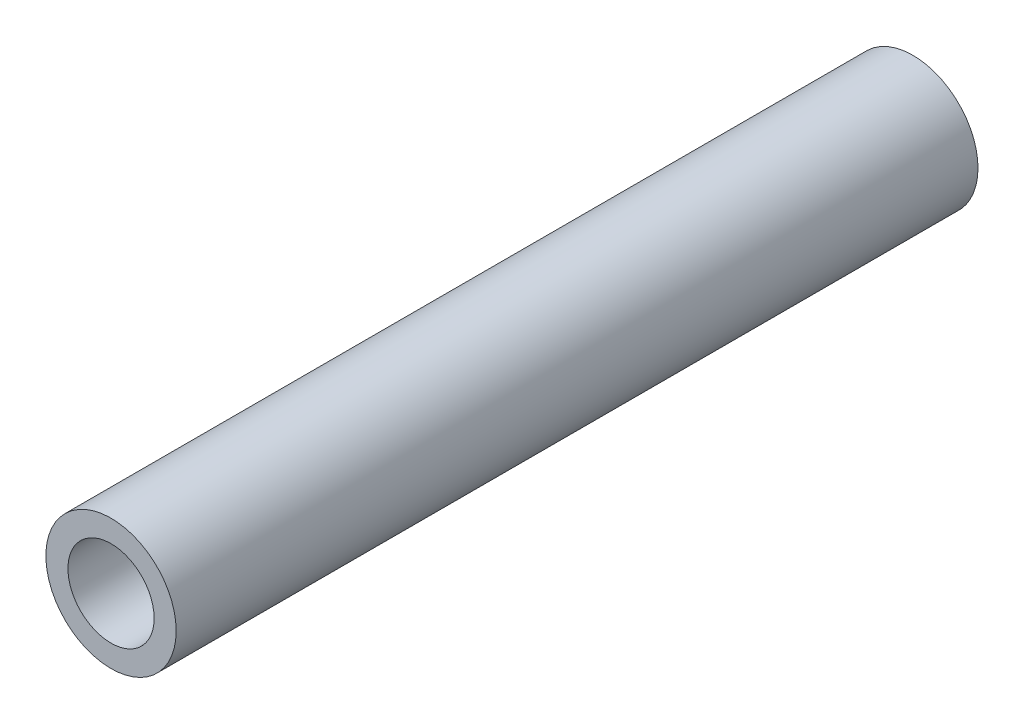
ISO-10303-21;
HEADER;
FILE_DESCRIPTION(('STEP AP214'),'2;1');
FILE_NAME('part.step','',(''),(''),'','','');
FILE_SCHEMA(('AUTOMOTIVE_DESIGN { 1 0 10303 214 1 1 1 1 }'));
ENDSEC;
DATA;
#1=APPLICATION_CONTEXT('core data for automotive mechanical design processes');
#2=APPLICATION_PROTOCOL_DEFINITION('international standard','automotive_design',2000,#1);
#3=PRODUCT_CONTEXT('',#1,'mechanical');
#4=PRODUCT('Part','Part','',(#3));
#5=PRODUCT_RELATED_PRODUCT_CATEGORY('part','',(#4));
#6=PRODUCT_DEFINITION_FORMATION('','',#4);
#7=PRODUCT_DEFINITION_CONTEXT('part definition',#1,'design');
#8=PRODUCT_DEFINITION('design','',#6,#7);
#9=PRODUCT_DEFINITION_SHAPE('','',#8);
#10=(LENGTH_UNIT() NAMED_UNIT(*) SI_UNIT(.MILLI.,.METRE.));
#11=(NAMED_UNIT(*) PLANE_ANGLE_UNIT() SI_UNIT($,.RADIAN.));
#12=(NAMED_UNIT(*) SI_UNIT($,.STERADIAN.) SOLID_ANGLE_UNIT());
#13=UNCERTAINTY_MEASURE_WITH_UNIT(LENGTH_MEASURE(1.E-05),#10,'distance_accuracy_value','');
#14=(GEOMETRIC_REPRESENTATION_CONTEXT(3) GLOBAL_UNCERTAINTY_ASSIGNED_CONTEXT((#13)) GLOBAL_UNIT_ASSIGNED_CONTEXT((#10,
#11,#12)) REPRESENTATION_CONTEXT('',''));
#15=CARTESIAN_POINT('',(0.,0.,0.));
#16=DIRECTION('',(0.,0.,1.));
#17=DIRECTION('',(1.,0.,0.));
#18=AXIS2_PLACEMENT_3D('',#15,#16,#17);
#19=CARTESIAN_POINT('',(67.6066017177982,-8.50660171779819,80.));
#20=DIRECTION('',(0.,0.,1.));
#21=DIRECTION('',(1.,0.,0.));
#22=AXIS2_PLACEMENT_3D('',#19,#20,#21);
#23=PLANE('',#22);
#24=CARTESIAN_POINT('',(67.6066017177982,-8.50660171779819,80.));
#25=DIRECTION('',(0.,0.,1.));
#26=DIRECTION('',(1.,0.,0.));
#27=AXIS2_PLACEMENT_3D('',#24,#25,#26);
#28=CIRCLE('',#27,6.5);
#29=CARTESIAN_POINT('',(74.1066017177982,-8.50660171779819,80.));
#30=VERTEX_POINT('',#29);
#31=EDGE_CURVE('E10',#30,#30,#28,.T.);
#32=ORIENTED_EDGE('',*,*,#31,.T.);
#33=EDGE_LOOP('',(#32));
#34=FACE_BOUND('',#33,.T.);
#35=CARTESIAN_POINT('',(67.6066017177982,-8.50660171779819,80.));
#36=DIRECTION('',(0.,0.,1.));
#37=DIRECTION('',(1.,0.,0.));
#38=AXIS2_PLACEMENT_3D('',#35,#36,#37);
#39=CIRCLE('',#38,4.29999999999999);
#40=CARTESIAN_POINT('',(71.9066017177982,-8.50660171779819,80.));
#41=VERTEX_POINT('',#40);
#42=EDGE_CURVE('E42',#41,#41,#39,.T.);
#43=ORIENTED_EDGE('',*,*,#42,.F.);
#44=EDGE_LOOP('',(#43));
#45=FACE_BOUND('',#44,.T.);
#46=ADVANCED_FACE('F31',(#34,#45),#23,.T.);
#47=CARTESIAN_POINT('',(67.6066017177982,-8.50660171779819,0.));
#48=DIRECTION('',(0.,0.,1.));
#49=DIRECTION('',(1.,0.,0.));
#50=AXIS2_PLACEMENT_3D('',#47,#48,#49);
#51=PLANE('',#50);
#52=CARTESIAN_POINT('',(67.6066017177982,-8.50660171779819,0.));
#53=DIRECTION('',(0.,0.,1.));
#54=DIRECTION('',(1.,0.,0.));
#55=AXIS2_PLACEMENT_3D('',#52,#53,#54);
#56=CIRCLE('',#55,6.5);
#57=CARTESIAN_POINT('',(74.1066017177982,-8.50660171779819,0.));
#58=VERTEX_POINT('',#57);
#59=EDGE_CURVE('E35',#58,#58,#56,.T.);
#60=ORIENTED_EDGE('',*,*,#59,.F.);
#61=EDGE_LOOP('',(#60));
#62=FACE_BOUND('',#61,.T.);
#63=CARTESIAN_POINT('',(67.6066017177982,-8.50660171779819,0.));
#64=DIRECTION('',(0.,0.,1.));
#65=DIRECTION('',(1.,0.,0.));
#66=AXIS2_PLACEMENT_3D('',#63,#64,#65);
#67=CIRCLE('',#66,4.29999999999999);
#68=CARTESIAN_POINT('',(71.9066017177982,-8.50660171779819,0.));
#69=VERTEX_POINT('',#68);
#70=EDGE_CURVE('E44',#69,#69,#67,.T.);
#71=ORIENTED_EDGE('',*,*,#70,.T.);
#72=EDGE_LOOP('',(#71));
#73=FACE_BOUND('',#72,.T.);
#74=ADVANCED_FACE('F54',(#62,#73),#51,.F.);
#75=CARTESIAN_POINT('',(67.6066017177982,-8.50660171779819,80.));
#76=DIRECTION('',(0.,0.,-1.));
#77=DIRECTION('',(-1.,0.,0.));
#78=AXIS2_PLACEMENT_3D('',#75,#76,#77);
#79=CYLINDRICAL_SURFACE('',#78,6.5);
#80=ORIENTED_EDGE('',*,*,#31,.F.);
#81=EDGE_LOOP('',(#80));
#82=FACE_BOUND('',#81,.T.);
#83=ORIENTED_EDGE('',*,*,#59,.T.);
#84=EDGE_LOOP('',(#83));
#85=FACE_BOUND('',#84,.T.);
#86=ADVANCED_FACE('F33',(#82,#85),#79,.T.);
#87=CARTESIAN_POINT('',(67.6066017177982,-8.50660171779819,80.));
#88=DIRECTION('',(0.,0.,-1.));
#89=DIRECTION('',(-1.,0.,0.));
#90=AXIS2_PLACEMENT_3D('',#87,#88,#89);
#91=CYLINDRICAL_SURFACE('',#90,4.29999999999999);
#92=ORIENTED_EDGE('',*,*,#42,.T.);
#93=EDGE_LOOP('',(#92));
#94=FACE_BOUND('',#93,.T.);
#95=ORIENTED_EDGE('',*,*,#70,.F.);
#96=EDGE_LOOP('',(#95));
#97=FACE_BOUND('',#96,.T.);
#98=ADVANCED_FACE('F50',(#94,#97),#91,.F.);
#99=CLOSED_SHELL('',(#46,#74,#86,#98));
#100=MANIFOLD_SOLID_BREP('B2',#99);
#101=ADVANCED_BREP_SHAPE_REPRESENTATION('',(#18,#100),#14);
#102=SHAPE_DEFINITION_REPRESENTATION(#9,#101);
ENDSEC;
END-ISO-10303-21;
